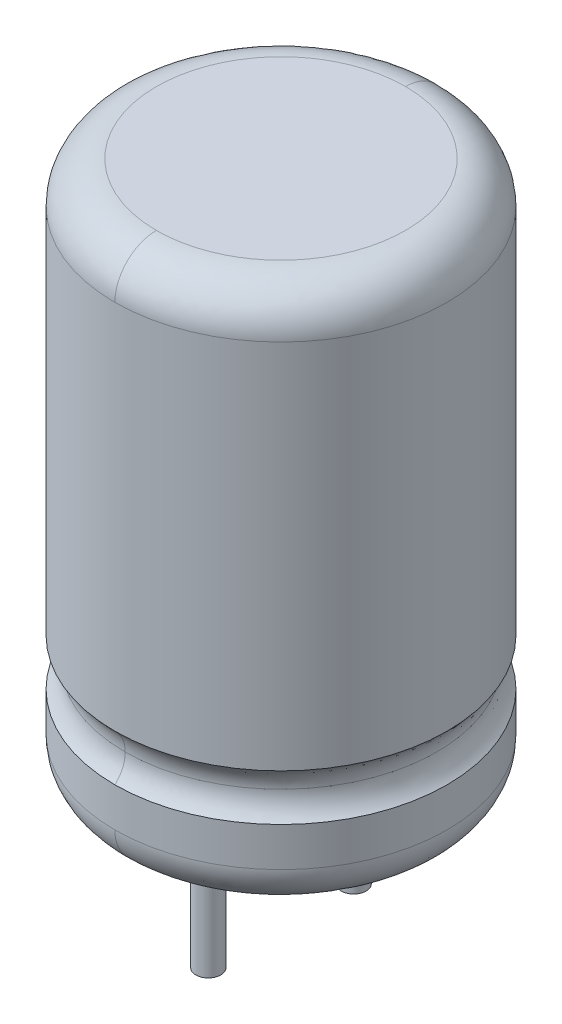
ISO-10303-21;
HEADER;
FILE_DESCRIPTION(('STEP AP214'),'2;1');
FILE_NAME('part.step','',(''),(''),'','','');
FILE_SCHEMA(('AUTOMOTIVE_DESIGN { 1 0 10303 214 1 1 1 1 }'));
ENDSEC;
DATA;
#1=APPLICATION_CONTEXT('core data for automotive mechanical design processes');
#2=APPLICATION_PROTOCOL_DEFINITION('international standard','automotive_design',2000,#1);
#3=PRODUCT_CONTEXT('',#1,'mechanical');
#4=PRODUCT('Part','Part','',(#3));
#5=PRODUCT_RELATED_PRODUCT_CATEGORY('part','',(#4));
#6=PRODUCT_DEFINITION_FORMATION('','',#4);
#7=PRODUCT_DEFINITION_CONTEXT('part definition',#1,'design');
#8=PRODUCT_DEFINITION('design','',#6,#7);
#9=PRODUCT_DEFINITION_SHAPE('','',#8);
#10=(LENGTH_UNIT() NAMED_UNIT(*) SI_UNIT(.MILLI.,.METRE.));
#11=(NAMED_UNIT(*) PLANE_ANGLE_UNIT() SI_UNIT($,.RADIAN.));
#12=(NAMED_UNIT(*) SI_UNIT($,.STERADIAN.) SOLID_ANGLE_UNIT());
#13=UNCERTAINTY_MEASURE_WITH_UNIT(LENGTH_MEASURE(1.E-05),#10,'distance_accuracy_value','');
#14=(GEOMETRIC_REPRESENTATION_CONTEXT(3) GLOBAL_UNCERTAINTY_ASSIGNED_CONTEXT((#13)) GLOBAL_UNIT_ASSIGNED_CONTEXT((#10,
#11,#12)) REPRESENTATION_CONTEXT('',''));
#15=CARTESIAN_POINT('',(0.,0.,0.));
#16=DIRECTION('',(0.,0.,1.));
#17=DIRECTION('',(1.,0.,0.));
#18=AXIS2_PLACEMENT_3D('',#15,#16,#17);
#19=CARTESIAN_POINT('',(-0.3036,-3.,2.0536));
#20=DIRECTION('',(0.,-1.,0.));
#21=DIRECTION('',(0.,0.,-1.));
#22=AXIS2_PLACEMENT_3D('',#19,#20,#21);
#23=PLANE('',#22);
#24=CARTESIAN_POINT('',(0.,-3.,1.75));
#25=DIRECTION('',(0.,1.,0.));
#26=DIRECTION('',(0.,0.,1.));
#27=AXIS2_PLACEMENT_3D('',#24,#25,#26);
#28=CIRCLE('',#27,0.299999999999999);
#29=CARTESIAN_POINT('',(0.,-3.,2.05));
#30=VERTEX_POINT('',#29);
#31=EDGE_CURVE('E22',#30,#30,#28,.F.);
#32=ORIENTED_EDGE('',*,*,#31,.T.);
#33=EDGE_LOOP('',(#32));
#34=FACE_BOUND('',#33,.T.);
#35=ADVANCED_FACE('F17',(#34),#23,.T.);
#36=CARTESIAN_POINT('',(-0.3036,-3.,-1.4464));
#37=DIRECTION('',(0.,-1.,0.));
#38=DIRECTION('',(0.,0.,-1.));
#39=AXIS2_PLACEMENT_3D('',#36,#37,#38);
#40=PLANE('',#39);
#41=CARTESIAN_POINT('',(0.,-3.,-1.75));
#42=DIRECTION('',(0.,1.,0.));
#43=DIRECTION('',(0.,0.,1.));
#44=AXIS2_PLACEMENT_3D('',#41,#42,#43);
#45=CIRCLE('',#44,0.3);
#46=CARTESIAN_POINT('',(0.,-3.,-1.45));
#47=VERTEX_POINT('',#46);
#48=EDGE_CURVE('E249',#47,#47,#45,.F.);
#49=ORIENTED_EDGE('',*,*,#48,.T.);
#50=EDGE_LOOP('',(#49));
#51=FACE_BOUND('',#50,.T.);
#52=ADVANCED_FACE('F194',(#51),#40,.T.);
#53=CARTESIAN_POINT('',(0.,2.574875062,3.753746876));
#54=CARTESIAN_POINT('',(-7.507493752,2.574875062,3.753746876));
#55=CARTESIAN_POINT('',(-7.507493752,2.574875062,-3.753746876));
#56=CARTESIAN_POINT('',(0.,2.574875062,-3.753746876));
#57=CARTESIAN_POINT('',(0.,2.303482148,3.726516757));
#58=CARTESIAN_POINT('',(-7.453033514,2.303482148,3.726516757));
#59=CARTESIAN_POINT('',(-7.453033514,2.303482148,-3.726516757));
#60=CARTESIAN_POINT('',(0.,2.303482148,-3.726516757));
#61=CARTESIAN_POINT('',(0.,2.054491531,3.837868746));
#62=CARTESIAN_POINT('',(-7.675737493,2.054491531,3.837868746));
#63=CARTESIAN_POINT('',(-7.675737493,2.054491531,-3.837868746));
#64=CARTESIAN_POINT('',(0.,2.054491531,-3.837868746));
#65=CARTESIAN_POINT('',(0.,1.893859054,4.058306494));
#66=CARTESIAN_POINT('',(-8.116612988,1.893859054,4.058306494));
#67=CARTESIAN_POINT('',(-8.116612988,1.893859054,-4.058306494));
#68=CARTESIAN_POINT('',(0.,1.893859054,-4.058306494));
#69=(BOUNDED_SURFACE() B_SPLINE_SURFACE(3,3,((#53,#54,#55,#56),(#57,#58,#59,#60),(#61,#62,#63,
#64),(#65,#66,#67,#68)),.UNSPECIFIED.,.F.,.F.,.F.) B_SPLINE_SURFACE_WITH_KNOTS((4,4),(4,4),(0.,
1.),(0.,1.),.UNSPECIFIED.) GEOMETRIC_REPRESENTATION_ITEM() RATIONAL_B_SPLINE_SURFACE(((1.,
0.333333333333333,0.333333333333333,1.),(0.911702370142259,0.30390079004742,0.30390079004742,
0.911702370142259),(0.911702370142259,0.30390079004742,0.30390079004742,0.911702370142259),(1.,
0.333333333333333,0.333333333333333,1.))) REPRESENTATION_ITEM('') SURFACE());
#70=CARTESIAN_POINT('',(0.,2.5000000002795,0.));
#71=DIRECTION('',(0.,-1.,0.));
#72=DIRECTION('',(1.,0.,0.));
#73=AXIS2_PLACEMENT_3D('',#70,#71,#72);
#74=CIRCLE('',#73,3.74999999996002);
#75=CARTESIAN_POINT('',(0.,2.5,3.74999999996002));
#76=VERTEX_POINT('',#75);
#77=CARTESIAN_POINT('',(0.,2.5,-3.74999999996002));
#78=VERTEX_POINT('',#77);
#79=EDGE_CURVE('E323',#76,#78,#74,.T.);
#80=CARTESIAN_POINT('',(0.,2.574875062,-3.753746876));
#81=CARTESIAN_POINT('',(0.,2.303482148,-3.726516757));
#82=CARTESIAN_POINT('',(0.,2.054491531,-3.837868746));
#83=CARTESIAN_POINT('',(0.,1.893859054,-4.058306494));
#84=(BOUNDED_CURVE() B_SPLINE_CURVE(3,(#80,#81,#82,#83),.UNSPECIFIED.,.F.,
.F.) B_SPLINE_CURVE_WITH_KNOTS((4,4),(0.,1.),
.UNSPECIFIED.) CURVE() GEOMETRIC_REPRESENTATION_ITEM() RATIONAL_B_SPLINE_CURVE((1.,
0.911702370142259,0.911702370142259,1.)) REPRESENTATION_ITEM(''));
#85=CARTESIAN_POINT('',(-4.78899351625253E-10,1.94098300579185,-4.00000000009521));
#86=VERTEX_POINT('',#85);
#87=EDGE_CURVE('E74',#86,#78,#84,.F.);
#88=CARTESIAN_POINT('',(0.,1.94098300568778,0.));
#89=DIRECTION('',(0.,-1.,0.));
#90=DIRECTION('',(0.,0.,-1.));
#91=AXIS2_PLACEMENT_3D('',#88,#89,#90);
#92=CIRCLE('',#91,4.00000000014282);
#93=CARTESIAN_POINT('',(-1.64082742812265E-09,1.940983006,4.));
#94=VERTEX_POINT('',#93);
#95=EDGE_CURVE('E368',#94,#86,#92,.T.);
#96=CARTESIAN_POINT('',(0.,2.574875062,3.753746876));
#97=CARTESIAN_POINT('',(0.,2.303482148,3.726516757));
#98=CARTESIAN_POINT('',(0.,2.054491531,3.837868746));
#99=CARTESIAN_POINT('',(0.,1.893859054,4.058306494));
#100=(BOUNDED_CURVE() B_SPLINE_CURVE(3,(#96,#97,#98,#99),.UNSPECIFIED.,.F.,
.F.) B_SPLINE_CURVE_WITH_KNOTS((4,4),(0.,1.),
.UNSPECIFIED.) CURVE() GEOMETRIC_REPRESENTATION_ITEM() RATIONAL_B_SPLINE_CURVE((1.,
0.911702370142259,0.911702370142259,1.)) REPRESENTATION_ITEM(''));
#101=EDGE_CURVE('E101',#76,#94,#100,.T.);
#102=ORIENTED_EDGE('',*,*,#79,.T.);
#103=ORIENTED_EDGE('',*,*,#87,.F.);
#104=ORIENTED_EDGE('',*,*,#95,.F.);
#105=ORIENTED_EDGE('',*,*,#101,.F.);
#106=EDGE_LOOP('',(#102,#103,#104,#105));
#107=FACE_BOUND('',#106,.T.);
#108=ADVANCED_FACE('F184',(#107),#69,.F.);
#109=CARTESIAN_POINT('',(0.,1.099833417,-3.995004165));
#110=CARTESIAN_POINT('',(-7.990008331,1.099833417,-3.995004165));
#111=CARTESIAN_POINT('',(-7.990008331,1.099833417,3.995004165));
#112=CARTESIAN_POINT('',(0.,1.099833417,3.995004165));
#113=CARTESIAN_POINT('',(0.,0.419946235,-4.063220423));
#114=CARTESIAN_POINT('',(-8.126440845,0.419946235,-4.063220423));
#115=CARTESIAN_POINT('',(-8.126440845,0.419946235,4.063220423));
#116=CARTESIAN_POINT('',(0.,0.419946235,4.063220423));
#117=CARTESIAN_POINT('',(0.,-0.063220423,-3.580053765));
#118=CARTESIAN_POINT('',(-7.16010753,-0.063220423,-3.580053765));
#119=CARTESIAN_POINT('',(-7.16010753,-0.063220423,3.580053765));
#120=CARTESIAN_POINT('',(0.,-0.063220423,3.580053765));
#121=CARTESIAN_POINT('',(0.,0.004995835,-2.900166583));
#122=CARTESIAN_POINT('',(-5.800333167,0.004995835,-2.900166583));
#123=CARTESIAN_POINT('',(-5.800333167,0.004995835,2.900166583));
#124=CARTESIAN_POINT('',(0.,0.004995835,2.900166583));
#125=(BOUNDED_SURFACE() B_SPLINE_SURFACE(3,3,((#109,#110,#111,#112),(#113,#114,#115,#116),(#117,
#118,#119,#120),(#121,#122,#123,#124)),.UNSPECIFIED.,.F.,.F.,
.F.) B_SPLINE_SURFACE_WITH_KNOTS((4,4),(4,4),(0.,1.),(0.,1.),
.UNSPECIFIED.) GEOMETRIC_REPRESENTATION_ITEM() RATIONAL_B_SPLINE_SURFACE(((1.,0.333333333333333,
0.333333333333333,1.),(0.755320871117973,0.251773623705991,0.251773623705991,0.755320871117973),
(0.755320871117973,0.251773623705991,0.251773623705991,0.755320871117973),(1.,0.333333333333333,
0.333333333333333,1.))) REPRESENTATION_ITEM('') SURFACE());
#126=CARTESIAN_POINT('',(0.,1.099833417,3.995004165));
#127=CARTESIAN_POINT('',(0.,0.419946235,4.063220423));
#128=CARTESIAN_POINT('',(0.,-0.063220423,3.580053765));
#129=CARTESIAN_POINT('',(0.,0.004995835,2.900166583));
#130=(BOUNDED_CURVE() B_SPLINE_CURVE(3,(#126,#127,#128,#129),.UNSPECIFIED.,.F.,
.F.) B_SPLINE_CURVE_WITH_KNOTS((4,4),(0.,1.),
.UNSPECIFIED.) CURVE() GEOMETRIC_REPRESENTATION_ITEM() RATIONAL_B_SPLINE_CURVE((1.,
0.755320871117973,0.755320871117973,1.)) REPRESENTATION_ITEM(''));
#131=CARTESIAN_POINT('',(0.,1.23031840019095E-10,2.99999999939907));
#132=VERTEX_POINT('',#131);
#133=CARTESIAN_POINT('',(-4.10206857030662E-10,0.999999999900116,3.99999999989747));
#134=VERTEX_POINT('',#133);
#135=EDGE_CURVE('E94',#132,#134,#130,.F.);
#136=CARTESIAN_POINT('',(0.,0.999999999866821,0.));
#137=DIRECTION('',(0.,-1.,0.));
#138=DIRECTION('',(1.,0.,0.));
#139=AXIS2_PLACEMENT_3D('',#136,#137,#138);
#140=CIRCLE('',#139,3.99999999979495);
#141=CARTESIAN_POINT('',(-2.69380885283898E-10,0.999999999911214,-3.99999999989747));
#142=VERTEX_POINT('',#141);
#143=EDGE_CURVE('E83',#134,#142,#140,.T.);
#144=CARTESIAN_POINT('',(0.,1.099833417,-3.995004165));
#145=CARTESIAN_POINT('',(0.,0.419946235,-4.063220423));
#146=CARTESIAN_POINT('',(0.,-0.063220423,-3.580053765));
#147=CARTESIAN_POINT('',(0.,0.004995835,-2.900166583));
#148=(BOUNDED_CURVE() B_SPLINE_CURVE(3,(#144,#145,#146,#147),.UNSPECIFIED.,.F.,
.F.) B_SPLINE_CURVE_WITH_KNOTS((4,4),(0.,1.),
.UNSPECIFIED.) CURVE() GEOMETRIC_REPRESENTATION_ITEM() RATIONAL_B_SPLINE_CURVE((1.,
0.755320871117973,0.755320871117973,1.)) REPRESENTATION_ITEM(''));
#149=CARTESIAN_POINT('',(0.,1.23031840019095E-10,-2.99999999939907));
#150=VERTEX_POINT('',#149);
#151=EDGE_CURVE('E92',#142,#150,#148,.T.);
#152=CARTESIAN_POINT('',(0.,2.05053066848823E-10,-2.99999999991909));
#153=CARTESIAN_POINT('',(-6.00000000068921,2.05053061893842E-10,-2.99999999991909));
#154=CARTESIAN_POINT('',(-6.00000000068921,2.05053061893842E-10,2.99999999991909));
#155=CARTESIAN_POINT('',(0.,2.05053066848823E-10,2.99999999991909));
#156=(BOUNDED_CURVE() B_SPLINE_CURVE(3,(#152,#153,#154,#155),.UNSPECIFIED.,.F.,
.F.) B_SPLINE_CURVE_WITH_KNOTS((4,4),(0.,1.),
.UNSPECIFIED.) CURVE() GEOMETRIC_REPRESENTATION_ITEM() RATIONAL_B_SPLINE_CURVE((0.956578302250821,
0.318859434083607,0.318859434083607,0.956578302250821)) REPRESENTATION_ITEM(''));
#157=EDGE_CURVE('E234',#150,#132,#156,.T.);
#158=ORIENTED_EDGE('',*,*,#135,.T.);
#159=ORIENTED_EDGE('',*,*,#143,.T.);
#160=ORIENTED_EDGE('',*,*,#151,.T.);
#161=ORIENTED_EDGE('',*,*,#157,.T.);
#162=EDGE_LOOP('',(#158,#159,#160,#161));
#163=FACE_BOUND('',#162,.T.);
#164=ADVANCED_FACE('F90',(#163),#125,.T.);
#165=CARTESIAN_POINT('',(0.,-3.,1.75));
#166=DIRECTION('',(0.,1.,0.));
#167=DIRECTION('',(0.,0.,1.));
#168=AXIS2_PLACEMENT_3D('',#165,#166,#167);
#169=CYLINDRICAL_SURFACE('',#168,0.299999999999999);
#170=ORIENTED_EDGE('',*,*,#31,.F.);
#171=EDGE_LOOP('',(#170));
#172=FACE_BOUND('',#171,.T.);
#173=CARTESIAN_POINT('',(0.,0.,1.75));
#174=DIRECTION('',(0.,1.,0.));
#175=DIRECTION('',(0.,0.,1.));
#176=AXIS2_PLACEMENT_3D('',#173,#174,#175);
#177=CIRCLE('',#176,0.299999999999999);
#178=CARTESIAN_POINT('',(0.,0.,2.05));
#179=VERTEX_POINT('',#178);
#180=EDGE_CURVE('E247',#179,#179,#177,.F.);
#181=ORIENTED_EDGE('',*,*,#180,.T.);
#182=EDGE_LOOP('',(#181));
#183=FACE_BOUND('',#182,.T.);
#184=ADVANCED_FACE('F175',(#172,#183),#169,.T.);
#185=CARTESIAN_POINT('',(0.,-3.,-1.75));
#186=DIRECTION('',(0.,1.,0.));
#187=DIRECTION('',(0.,0.,1.));
#188=AXIS2_PLACEMENT_3D('',#185,#186,#187);
#189=CYLINDRICAL_SURFACE('',#188,0.3);
#190=ORIENTED_EDGE('',*,*,#48,.F.);
#191=EDGE_LOOP('',(#190));
#192=FACE_BOUND('',#191,.T.);
#193=CARTESIAN_POINT('',(0.,0.,-1.75));
#194=DIRECTION('',(0.,1.,0.));
#195=DIRECTION('',(0.,0.,1.));
#196=AXIS2_PLACEMENT_3D('',#193,#194,#195);
#197=CIRCLE('',#196,0.3);
#198=CARTESIAN_POINT('',(0.,0.,-1.45));
#199=VERTEX_POINT('',#198);
#200=EDGE_CURVE('E238',#199,#199,#197,.F.);
#201=ORIENTED_EDGE('',*,*,#200,.T.);
#202=EDGE_LOOP('',(#201));
#203=FACE_BOUND('',#202,.T.);
#204=ADVANCED_FACE('F166',(#192,#203),#189,.T.);
#205=CARTESIAN_POINT('',(0.,3.106140946,4.058306494));
#206=CARTESIAN_POINT('',(-8.116612988,3.106140946,4.058306494));
#207=CARTESIAN_POINT('',(-8.116612988,3.106140946,-4.058306494));
#208=CARTESIAN_POINT('',(0.,3.106140946,-4.058306494));
#209=CARTESIAN_POINT('',(0.,2.945508469,3.837868746));
#210=CARTESIAN_POINT('',(-7.675737493,2.945508469,3.837868746));
#211=CARTESIAN_POINT('',(-7.675737493,2.945508469,-3.837868746));
#212=CARTESIAN_POINT('',(0.,2.945508469,-3.837868746));
#213=CARTESIAN_POINT('',(0.,2.696517852,3.726516757));
#214=CARTESIAN_POINT('',(-7.453033514,2.696517852,3.726516757));
#215=CARTESIAN_POINT('',(-7.453033514,2.696517852,-3.726516757));
#216=CARTESIAN_POINT('',(0.,2.696517852,-3.726516757));
#217=CARTESIAN_POINT('',(0.,2.425124938,3.753746876));
#218=CARTESIAN_POINT('',(-7.507493752,2.425124938,3.753746876));
#219=CARTESIAN_POINT('',(-7.507493752,2.425124938,-3.753746876));
#220=CARTESIAN_POINT('',(0.,2.425124938,-3.753746876));
#221=(BOUNDED_SURFACE() B_SPLINE_SURFACE(3,3,((#205,#206,#207,#208),(#209,#210,#211,#212),(#213,
#214,#215,#216),(#217,#218,#219,#220)),.UNSPECIFIED.,.F.,.F.,
.F.) B_SPLINE_SURFACE_WITH_KNOTS((4,4),(4,4),(0.,1.),(0.,1.),
.UNSPECIFIED.) GEOMETRIC_REPRESENTATION_ITEM() RATIONAL_B_SPLINE_SURFACE(((1.,0.333333333333333,
0.333333333333333,1.),(0.911702370142259,0.30390079004742,0.30390079004742,0.911702370142259),
(0.911702370142259,0.30390079004742,0.30390079004742,0.911702370142259),(1.,0.333333333333333,
0.333333333333333,1.))) REPRESENTATION_ITEM('') SURFACE());
#222=CARTESIAN_POINT('',(0.,3.106140946,4.058306494));
#223=CARTESIAN_POINT('',(0.,2.945508469,3.837868746));
#224=CARTESIAN_POINT('',(0.,2.696517852,3.726516757));
#225=CARTESIAN_POINT('',(0.,2.425124938,3.753746876));
#226=(BOUNDED_CURVE() B_SPLINE_CURVE(3,(#222,#223,#224,#225),.UNSPECIFIED.,.F.,
.F.) B_SPLINE_CURVE_WITH_KNOTS((4,4),(0.,1.),
.UNSPECIFIED.) CURVE() GEOMETRIC_REPRESENTATION_ITEM() RATIONAL_B_SPLINE_CURVE((1.,
0.911702370142259,0.911702370142259,1.)) REPRESENTATION_ITEM(''));
#227=CARTESIAN_POINT('',(-6.15310285545994E-10,3.05901699419514,4.00000000008926));
#228=VERTEX_POINT('',#227);
#229=EDGE_CURVE('E252',#228,#76,#226,.T.);
#230=CARTESIAN_POINT('',(0.,3.059016994,0.));
#231=DIRECTION('',(0.,-1.,0.));
#232=DIRECTION('',(0.,0.,-1.));
#233=AXIS2_PLACEMENT_3D('',#230,#231,#232);
#234=CIRCLE('',#233,4.);
#235=CARTESIAN_POINT('',(-1.79587256857466E-10,3.05901699419514,-4.00000000008926));
#236=VERTEX_POINT('',#235);
#237=EDGE_CURVE('E246',#228,#236,#234,.T.);
#238=CARTESIAN_POINT('',(0.,3.106140946,-4.058306494));
#239=CARTESIAN_POINT('',(0.,2.945508469,-3.837868746));
#240=CARTESIAN_POINT('',(0.,2.696517852,-3.726516757));
#241=CARTESIAN_POINT('',(0.,2.425124938,-3.753746876));
#242=(BOUNDED_CURVE() B_SPLINE_CURVE(3,(#238,#239,#240,#241),.UNSPECIFIED.,.F.,
.F.) B_SPLINE_CURVE_WITH_KNOTS((4,4),(0.,1.),
.UNSPECIFIED.) CURVE() GEOMETRIC_REPRESENTATION_ITEM() RATIONAL_B_SPLINE_CURVE((1.,
0.911702370142259,0.911702370142259,1.)) REPRESENTATION_ITEM(''));
#243=EDGE_CURVE('E36',#78,#236,#242,.F.);
#244=ORIENTED_EDGE('',*,*,#229,.F.);
#245=ORIENTED_EDGE('',*,*,#237,.T.);
#246=ORIENTED_EDGE('',*,*,#243,.F.);
#247=ORIENTED_EDGE('',*,*,#79,.F.);
#248=EDGE_LOOP('',(#244,#245,#246,#247));
#249=FACE_BOUND('',#248,.T.);
#250=ADVANCED_FACE('F151',(#249),#221,.F.);
#251=CARTESIAN_POINT('',(0.,12.995004165,-2.900166583));
#252=CARTESIAN_POINT('',(-5.800333167,12.995004165,-2.900166583));
#253=CARTESIAN_POINT('',(-5.800333167,12.995004165,2.900166583));
#254=CARTESIAN_POINT('',(0.,12.995004165,2.900166583));
#255=CARTESIAN_POINT('',(0.,13.063220423,-3.580053765));
#256=CARTESIAN_POINT('',(-7.16010753,13.063220423,-3.580053765));
#257=CARTESIAN_POINT('',(-7.16010753,13.063220423,3.580053765));
#258=CARTESIAN_POINT('',(0.,13.063220423,3.580053765));
#259=CARTESIAN_POINT('',(0.,12.580053765,-4.063220423));
#260=CARTESIAN_POINT('',(-8.126440845,12.580053765,-4.063220423));
#261=CARTESIAN_POINT('',(-8.126440845,12.580053765,4.063220423));
#262=CARTESIAN_POINT('',(0.,12.580053765,4.063220423));
#263=CARTESIAN_POINT('',(0.,11.900166583,-3.995004165));
#264=CARTESIAN_POINT('',(-7.990008331,11.900166583,-3.995004165));
#265=CARTESIAN_POINT('',(-7.990008331,11.900166583,3.995004165));
#266=CARTESIAN_POINT('',(0.,11.900166583,3.995004165));
#267=(BOUNDED_SURFACE() B_SPLINE_SURFACE(3,3,((#251,#252,#253,#254),(#255,#256,#257,#258),(#259,
#260,#261,#262),(#263,#264,#265,#266)),.UNSPECIFIED.,.F.,.F.,
.F.) B_SPLINE_SURFACE_WITH_KNOTS((4,4),(4,4),(0.,1.),(0.,1.),
.UNSPECIFIED.) GEOMETRIC_REPRESENTATION_ITEM() RATIONAL_B_SPLINE_SURFACE(((1.,0.333333333333333,
0.333333333333333,1.),(0.755320871117972,0.251773623705991,0.251773623705991,0.755320871117972),
(0.755320871117972,0.251773623705991,0.251773623705991,0.755320871117972),(1.,0.333333333333333,
0.333333333333333,1.))) REPRESENTATION_ITEM('') SURFACE());
#268=CARTESIAN_POINT('',(0.,12.995004165,2.900166583));
#269=CARTESIAN_POINT('',(0.,13.063220423,3.580053765));
#270=CARTESIAN_POINT('',(0.,12.580053765,4.063220423));
#271=CARTESIAN_POINT('',(0.,11.900166583,3.995004165));
#272=(BOUNDED_CURVE() B_SPLINE_CURVE(3,(#268,#269,#270,#271),.UNSPECIFIED.,.F.,
.F.) B_SPLINE_CURVE_WITH_KNOTS((4,4),(0.,1.),
.UNSPECIFIED.) CURVE() GEOMETRIC_REPRESENTATION_ITEM() RATIONAL_B_SPLINE_CURVE((1.,
0.755320871117972,0.755320871117972,1.)) REPRESENTATION_ITEM(''));
#273=CARTESIAN_POINT('',(0.,12.0000000000832,3.99999999979495));
#274=VERTEX_POINT('',#273);
#275=CARTESIAN_POINT('',(0.,12.999999999877,2.99999999939907));
#276=VERTEX_POINT('',#275);
#277=EDGE_CURVE('E136',#274,#276,#272,.F.);
#278=CARTESIAN_POINT('',(0.,12.9999999997949,2.99999999991909));
#279=CARTESIAN_POINT('',(-6.00000000068921,12.9999999997949,2.99999999991909));
#280=CARTESIAN_POINT('',(-6.00000000068921,12.9999999997949,-2.99999999991909));
#281=CARTESIAN_POINT('',(0.,12.9999999997949,-2.99999999991909));
#282=(BOUNDED_CURVE() B_SPLINE_CURVE(3,(#278,#279,#280,#281),.UNSPECIFIED.,.F.,
.F.) B_SPLINE_CURVE_WITH_KNOTS((4,4),(0.,1.),
.UNSPECIFIED.) CURVE() GEOMETRIC_REPRESENTATION_ITEM() RATIONAL_B_SPLINE_CURVE((0.956578302250821,
0.318859434083607,0.318859434083607,0.956578302250821)) REPRESENTATION_ITEM(''));
#283=CARTESIAN_POINT('',(0.,12.999999999877,-2.99999999939907));
#284=VERTEX_POINT('',#283);
#285=EDGE_CURVE('E130',#284,#276,#282,.F.);
#286=CARTESIAN_POINT('',(0.,12.995004165,-2.900166583));
#287=CARTESIAN_POINT('',(0.,13.063220423,-3.580053765));
#288=CARTESIAN_POINT('',(0.,12.580053765,-4.063220423));
#289=CARTESIAN_POINT('',(0.,11.900166583,-3.995004165));
#290=(BOUNDED_CURVE() B_SPLINE_CURVE(3,(#286,#287,#288,#289),.UNSPECIFIED.,.F.,
.F.) B_SPLINE_CURVE_WITH_KNOTS((4,4),(0.,1.),
.UNSPECIFIED.) CURVE() GEOMETRIC_REPRESENTATION_ITEM() RATIONAL_B_SPLINE_CURVE((1.,
0.755320871117972,0.755320871117972,1.)) REPRESENTATION_ITEM(''));
#291=CARTESIAN_POINT('',(-1.19724837908813E-10,12.0000000000277,-3.99999999993165));
#292=VERTEX_POINT('',#291);
#293=EDGE_CURVE('E330',#284,#292,#290,.T.);
#294=CARTESIAN_POINT('',(0.,12.,0.));
#295=DIRECTION('',(0.,-1.,0.));
#296=DIRECTION('',(0.,0.,-1.));
#297=AXIS2_PLACEMENT_3D('',#294,#295,#296);
#298=CIRCLE('',#297,4.);
#299=EDGE_CURVE('E353',#292,#274,#298,.F.);
#300=ORIENTED_EDGE('',*,*,#277,.T.);
#301=ORIENTED_EDGE('',*,*,#285,.F.);
#302=ORIENTED_EDGE('',*,*,#293,.T.);
#303=ORIENTED_EDGE('',*,*,#299,.T.);
#304=EDGE_LOOP('',(#300,#301,#302,#303));
#305=FACE_BOUND('',#304,.T.);
#306=ADVANCED_FACE('F138',(#305),#267,.T.);
#307=CARTESIAN_POINT('',(-3.036,13.,-3.036));
#308=DIRECTION('',(0.,1.,0.));
#309=DIRECTION('',(0.,0.,1.));
#310=AXIS2_PLACEMENT_3D('',#307,#308,#309);
#311=PLANE('',#310);
#312=CARTESIAN_POINT('',(0.,12.9999999997949,-2.99999999991909));
#313=CARTESIAN_POINT('',(6.00000000068921,12.9999999997949,-2.99999999991909));
#314=CARTESIAN_POINT('',(6.00000000068921,12.9999999997949,2.99999999991909));
#315=CARTESIAN_POINT('',(0.,12.9999999997949,2.99999999991909));
#316=(BOUNDED_CURVE() B_SPLINE_CURVE(3,(#312,#313,#314,#315),.UNSPECIFIED.,.F.,
.F.) B_SPLINE_CURVE_WITH_KNOTS((4,4),(0.,1.),
.UNSPECIFIED.) CURVE() GEOMETRIC_REPRESENTATION_ITEM() RATIONAL_B_SPLINE_CURVE((0.956578302250821,
0.318859434083607,0.318859434083607,0.956578302250821)) REPRESENTATION_ITEM(''));
#317=EDGE_CURVE('E319',#284,#276,#316,.T.);
#318=ORIENTED_EDGE('',*,*,#317,.F.);
#319=ORIENTED_EDGE('',*,*,#285,.T.);
#320=EDGE_LOOP('',(#318,#319));
#321=FACE_BOUND('',#320,.T.);
#322=ADVANCED_FACE('F150',(#321),#311,.T.);
#323=CARTESIAN_POINT('',(-3.036,0.,-3.036));
#324=DIRECTION('',(0.,1.,0.));
#325=DIRECTION('',(0.,0.,1.));
#326=AXIS2_PLACEMENT_3D('',#323,#324,#325);
#327=PLANE('',#326);
#328=ORIENTED_EDGE('',*,*,#200,.F.);
#329=EDGE_LOOP('',(#328));
#330=FACE_BOUND('',#329,.T.);
#331=ORIENTED_EDGE('',*,*,#180,.F.);
#332=EDGE_LOOP('',(#331));
#333=FACE_BOUND('',#332,.T.);
#334=CARTESIAN_POINT('',(0.,2.05053066848823E-10,2.99999999991909));
#335=CARTESIAN_POINT('',(6.00000000068921,2.05053061893842E-10,2.99999999991909));
#336=CARTESIAN_POINT('',(6.00000000068921,2.05053061893842E-10,-2.99999999991909));
#337=CARTESIAN_POINT('',(0.,2.05053066848823E-10,-2.99999999991909));
#338=(BOUNDED_CURVE() B_SPLINE_CURVE(3,(#334,#335,#336,#337),.UNSPECIFIED.,.F.,
.F.) B_SPLINE_CURVE_WITH_KNOTS((4,4),(0.,1.),
.UNSPECIFIED.) CURVE() GEOMETRIC_REPRESENTATION_ITEM() RATIONAL_B_SPLINE_CURVE((0.956578302250821,
0.318859434083607,0.318859434083607,0.956578302250821)) REPRESENTATION_ITEM(''));
#339=EDGE_CURVE('E99',#132,#150,#338,.T.);
#340=ORIENTED_EDGE('',*,*,#339,.F.);
#341=ORIENTED_EDGE('',*,*,#157,.F.);
#342=EDGE_LOOP('',(#340,#341));
#343=FACE_BOUND('',#342,.T.);
#344=ADVANCED_FACE('F19',(#330,#333,#343),#327,.F.);
#345=CARTESIAN_POINT('',(0.,12.995004165,2.900166583));
#346=CARTESIAN_POINT('',(5.800333167,12.995004165,2.900166583));
#347=CARTESIAN_POINT('',(5.800333167,12.995004165,-2.900166583));
#348=CARTESIAN_POINT('',(0.,12.995004165,-2.900166583));
#349=CARTESIAN_POINT('',(0.,13.063220423,3.580053765));
#350=CARTESIAN_POINT('',(7.16010753,13.063220423,3.580053765));
#351=CARTESIAN_POINT('',(7.16010753,13.063220423,-3.580053765));
#352=CARTESIAN_POINT('',(0.,13.063220423,-3.580053765));
#353=CARTESIAN_POINT('',(0.,12.580053765,4.063220423));
#354=CARTESIAN_POINT('',(8.126440845,12.580053765,4.063220423));
#355=CARTESIAN_POINT('',(8.126440845,12.580053765,-4.063220423));
#356=CARTESIAN_POINT('',(0.,12.580053765,-4.063220423));
#357=CARTESIAN_POINT('',(0.,11.900166583,3.995004165));
#358=CARTESIAN_POINT('',(7.990008331,11.900166583,3.995004165));
#359=CARTESIAN_POINT('',(7.990008331,11.900166583,-3.995004165));
#360=CARTESIAN_POINT('',(0.,11.900166583,-3.995004165));
#361=(BOUNDED_SURFACE() B_SPLINE_SURFACE(3,3,((#345,#346,#347,#348),(#349,#350,#351,#352),(#353,
#354,#355,#356),(#357,#358,#359,#360)),.UNSPECIFIED.,.F.,.F.,
.F.) B_SPLINE_SURFACE_WITH_KNOTS((4,4),(4,4),(0.,1.),(0.,1.),
.UNSPECIFIED.) GEOMETRIC_REPRESENTATION_ITEM() RATIONAL_B_SPLINE_SURFACE(((1.,0.333333333333333,
0.333333333333333,1.),(0.755320871117972,0.251773623705991,0.251773623705991,0.755320871117972),
(0.755320871117972,0.251773623705991,0.251773623705991,0.755320871117972),(1.,0.333333333333333,
0.333333333333333,1.))) REPRESENTATION_ITEM('') SURFACE());
#362=CARTESIAN_POINT('',(0.,12.,0.));
#363=DIRECTION('',(0.,-1.,0.));
#364=DIRECTION('',(0.,0.,-1.));
#365=AXIS2_PLACEMENT_3D('',#362,#363,#364);
#366=CIRCLE('',#365,4.);
#367=EDGE_CURVE('E87',#274,#292,#366,.F.);
#368=ORIENTED_EDGE('',*,*,#317,.T.);
#369=ORIENTED_EDGE('',*,*,#277,.F.);
#370=ORIENTED_EDGE('',*,*,#367,.T.);
#371=ORIENTED_EDGE('',*,*,#293,.F.);
#372=EDGE_LOOP('',(#368,#369,#370,#371));
#373=FACE_BOUND('',#372,.T.);
#374=ADVANCED_FACE('F152',(#373),#361,.T.);
#375=CARTESIAN_POINT('',(0.,1.099833417,3.995004165));
#376=CARTESIAN_POINT('',(7.990008331,1.099833417,3.995004165));
#377=CARTESIAN_POINT('',(7.990008331,1.099833417,-3.995004165));
#378=CARTESIAN_POINT('',(0.,1.099833417,-3.995004165));
#379=CARTESIAN_POINT('',(0.,0.419946235,4.063220423));
#380=CARTESIAN_POINT('',(8.126440845,0.419946235,4.063220423));
#381=CARTESIAN_POINT('',(8.126440845,0.419946235,-4.063220423));
#382=CARTESIAN_POINT('',(0.,0.419946235,-4.063220423));
#383=CARTESIAN_POINT('',(0.,-0.063220423,3.580053765));
#384=CARTESIAN_POINT('',(7.16010753,-0.063220423,3.580053765));
#385=CARTESIAN_POINT('',(7.16010753,-0.063220423,-3.580053765));
#386=CARTESIAN_POINT('',(0.,-0.063220423,-3.580053765));
#387=CARTESIAN_POINT('',(0.,0.004995835,2.900166583));
#388=CARTESIAN_POINT('',(5.800333167,0.004995835,2.900166583));
#389=CARTESIAN_POINT('',(5.800333167,0.004995835,-2.900166583));
#390=CARTESIAN_POINT('',(0.,0.004995835,-2.900166583));
#391=(BOUNDED_SURFACE() B_SPLINE_SURFACE(3,3,((#375,#376,#377,#378),(#379,#380,#381,#382),(#383,
#384,#385,#386),(#387,#388,#389,#390)),.UNSPECIFIED.,.F.,.F.,
.F.) B_SPLINE_SURFACE_WITH_KNOTS((4,4),(4,4),(0.,1.),(0.,1.),
.UNSPECIFIED.) GEOMETRIC_REPRESENTATION_ITEM() RATIONAL_B_SPLINE_SURFACE(((1.,0.333333333333333,
0.333333333333333,1.),(0.755320871117973,0.251773623705991,0.251773623705991,0.755320871117973),
(0.755320871117973,0.251773623705991,0.251773623705991,0.755320871117973),(1.,0.333333333333333,
0.333333333333333,1.))) REPRESENTATION_ITEM('') SURFACE());
#392=CARTESIAN_POINT('',(0.,1.,0.));
#393=DIRECTION('',(0.,-1.,0.));
#394=DIRECTION('',(0.,0.,-1.));
#395=AXIS2_PLACEMENT_3D('',#392,#393,#394);
#396=CIRCLE('',#395,4.);
#397=EDGE_CURVE('E80',#142,#134,#396,.T.);
#398=ORIENTED_EDGE('',*,*,#397,.T.);
#399=ORIENTED_EDGE('',*,*,#135,.F.);
#400=ORIENTED_EDGE('',*,*,#339,.T.);
#401=ORIENTED_EDGE('',*,*,#151,.F.);
#402=EDGE_LOOP('',(#398,#399,#400,#401));
#403=FACE_BOUND('',#402,.T.);
#404=ADVANCED_FACE('F97',(#403),#391,.T.);
#405=CARTESIAN_POINT('',(0.,12.,0.));
#406=DIRECTION('',(0.,-1.,0.));
#407=DIRECTION('',(0.,0.,-1.));
#408=AXIS2_PLACEMENT_3D('',#405,#406,#407);
#409=CYLINDRICAL_SURFACE('',#408,4.);
#410=CARTESIAN_POINT('',(0.,3.05901699431222,0.));
#411=DIRECTION('',(0.,1.,0.));
#412=DIRECTION('',(-1.,0.,0.));
#413=AXIS2_PLACEMENT_3D('',#410,#411,#412);
#414=CIRCLE('',#413,4.00000000014282);
#415=EDGE_CURVE('E86',#228,#236,#414,.T.);
#416=ORIENTED_EDGE('',*,*,#415,.T.);
#417=ORIENTED_EDGE('',*,*,#237,.F.);
#418=EDGE_LOOP('',(#416,#417));
#419=FACE_BOUND('',#418,.T.);
#420=ORIENTED_EDGE('',*,*,#367,.F.);
#421=ORIENTED_EDGE('',*,*,#299,.F.);
#422=EDGE_LOOP('',(#420,#421));
#423=FACE_BOUND('',#422,.T.);
#424=ADVANCED_FACE('F294',(#419,#423),#409,.T.);
#425=CARTESIAN_POINT('',(0.,1.940983006,0.));
#426=DIRECTION('',(0.,-1.,0.));
#427=DIRECTION('',(1.,0.,0.));
#428=AXIS2_PLACEMENT_3D('',#425,#426,#427);
#429=CYLINDRICAL_SURFACE('',#428,4.);
#430=ORIENTED_EDGE('',*,*,#95,.T.);
#431=CARTESIAN_POINT('',(0.,1.94098300568778,0.));
#432=DIRECTION('',(0.,-1.,0.));
#433=DIRECTION('',(0.,0.,-1.));
#434=AXIS2_PLACEMENT_3D('',#431,#432,#433);
#435=CIRCLE('',#434,4.00000000014282);
#436=EDGE_CURVE('E28',#86,#94,#435,.T.);
#437=ORIENTED_EDGE('',*,*,#436,.T.);
#438=EDGE_LOOP('',(#430,#437));
#439=FACE_BOUND('',#438,.T.);
#440=ORIENTED_EDGE('',*,*,#397,.F.);
#441=ORIENTED_EDGE('',*,*,#143,.F.);
#442=EDGE_LOOP('',(#440,#441));
#443=FACE_BOUND('',#442,.T.);
#444=ADVANCED_FACE('F82',(#439,#443),#429,.T.);
#445=CARTESIAN_POINT('',(0.,3.106140946,-4.058306494));
#446=CARTESIAN_POINT('',(8.116612988,3.106140946,-4.058306494));
#447=CARTESIAN_POINT('',(8.116612988,3.106140946,4.058306494));
#448=CARTESIAN_POINT('',(0.,3.106140946,4.058306494));
#449=CARTESIAN_POINT('',(0.,2.945508469,-3.837868746));
#450=CARTESIAN_POINT('',(7.675737493,2.945508469,-3.837868746));
#451=CARTESIAN_POINT('',(7.675737493,2.945508469,3.837868746));
#452=CARTESIAN_POINT('',(0.,2.945508469,3.837868746));
#453=CARTESIAN_POINT('',(0.,2.696517852,-3.726516757));
#454=CARTESIAN_POINT('',(7.453033514,2.696517852,-3.726516757));
#455=CARTESIAN_POINT('',(7.453033514,2.696517852,3.726516757));
#456=CARTESIAN_POINT('',(0.,2.696517852,3.726516757));
#457=CARTESIAN_POINT('',(0.,2.425124938,-3.753746876));
#458=CARTESIAN_POINT('',(7.507493752,2.425124938,-3.753746876));
#459=CARTESIAN_POINT('',(7.507493752,2.425124938,3.753746876));
#460=CARTESIAN_POINT('',(0.,2.425124938,3.753746876));
#461=(BOUNDED_SURFACE() B_SPLINE_SURFACE(3,3,((#445,#446,#447,#448),(#449,#450,#451,#452),(#453,
#454,#455,#456),(#457,#458,#459,#460)),.UNSPECIFIED.,.F.,.F.,
.F.) B_SPLINE_SURFACE_WITH_KNOTS((4,4),(4,4),(0.,1.),(0.,1.),
.UNSPECIFIED.) GEOMETRIC_REPRESENTATION_ITEM() RATIONAL_B_SPLINE_SURFACE(((1.,0.333333333333333,
0.333333333333333,1.),(0.911702370142259,0.30390079004742,0.30390079004742,0.911702370142259),
(0.911702370142259,0.30390079004742,0.30390079004742,0.911702370142259),(1.,0.333333333333333,
0.333333333333333,1.))) REPRESENTATION_ITEM('') SURFACE());
#462=CARTESIAN_POINT('',(0.,2.4999999997205,0.));
#463=DIRECTION('',(0.,1.,0.));
#464=DIRECTION('',(-1.,0.,0.));
#465=AXIS2_PLACEMENT_3D('',#462,#463,#464);
#466=CIRCLE('',#465,3.74999999996002);
#467=EDGE_CURVE('E11',#76,#78,#466,.T.);
#468=ORIENTED_EDGE('',*,*,#243,.T.);
#469=ORIENTED_EDGE('',*,*,#415,.F.);
#470=ORIENTED_EDGE('',*,*,#229,.T.);
#471=ORIENTED_EDGE('',*,*,#467,.T.);
#472=EDGE_LOOP('',(#468,#469,#470,#471));
#473=FACE_BOUND('',#472,.T.);
#474=ADVANCED_FACE('F269',(#473),#461,.F.);
#475=CARTESIAN_POINT('',(0.,2.574875062,-3.753746876));
#476=CARTESIAN_POINT('',(7.507493752,2.574875062,-3.753746876));
#477=CARTESIAN_POINT('',(7.507493752,2.574875062,3.753746876));
#478=CARTESIAN_POINT('',(0.,2.574875062,3.753746876));
#479=CARTESIAN_POINT('',(0.,2.303482148,-3.726516757));
#480=CARTESIAN_POINT('',(7.453033514,2.303482148,-3.726516757));
#481=CARTESIAN_POINT('',(7.453033514,2.303482148,3.726516757));
#482=CARTESIAN_POINT('',(0.,2.303482148,3.726516757));
#483=CARTESIAN_POINT('',(0.,2.054491531,-3.837868746));
#484=CARTESIAN_POINT('',(7.675737493,2.054491531,-3.837868746));
#485=CARTESIAN_POINT('',(7.675737493,2.054491531,3.837868746));
#486=CARTESIAN_POINT('',(0.,2.054491531,3.837868746));
#487=CARTESIAN_POINT('',(0.,1.893859054,-4.058306494));
#488=CARTESIAN_POINT('',(8.116612988,1.893859054,-4.058306494));
#489=CARTESIAN_POINT('',(8.116612988,1.893859054,4.058306494));
#490=CARTESIAN_POINT('',(0.,1.893859054,4.058306494));
#491=(BOUNDED_SURFACE() B_SPLINE_SURFACE(3,3,((#475,#476,#477,#478),(#479,#480,#481,#482),(#483,
#484,#485,#486),(#487,#488,#489,#490)),.UNSPECIFIED.,.F.,.F.,
.F.) B_SPLINE_SURFACE_WITH_KNOTS((4,4),(4,4),(0.,1.),(0.,1.),
.UNSPECIFIED.) GEOMETRIC_REPRESENTATION_ITEM() RATIONAL_B_SPLINE_SURFACE(((1.,0.333333333333333,
0.333333333333333,1.),(0.911702370142259,0.30390079004742,0.30390079004742,0.911702370142259),
(0.911702370142259,0.30390079004742,0.30390079004742,0.911702370142259),(1.,0.333333333333333,
0.333333333333333,1.))) REPRESENTATION_ITEM('') SURFACE());
#492=ORIENTED_EDGE('',*,*,#467,.F.);
#493=ORIENTED_EDGE('',*,*,#101,.T.);
#494=ORIENTED_EDGE('',*,*,#436,.F.);
#495=ORIENTED_EDGE('',*,*,#87,.T.);
#496=EDGE_LOOP('',(#492,#493,#494,#495));
#497=FACE_BOUND('',#496,.T.);
#498=ADVANCED_FACE('F267',(#497),#491,.F.);
#499=CLOSED_SHELL('',(#35,#52,#108,#164,#184,#204,#250,#306,#322,#344,#374,#404,#424,#444,#474,#498));
#500=MANIFOLD_SOLID_BREP('B1',#499);
#501=ADVANCED_BREP_SHAPE_REPRESENTATION('',(#18,#500),#14);
#502=SHAPE_DEFINITION_REPRESENTATION(#9,#501);
ENDSEC;
END-ISO-10303-21;
